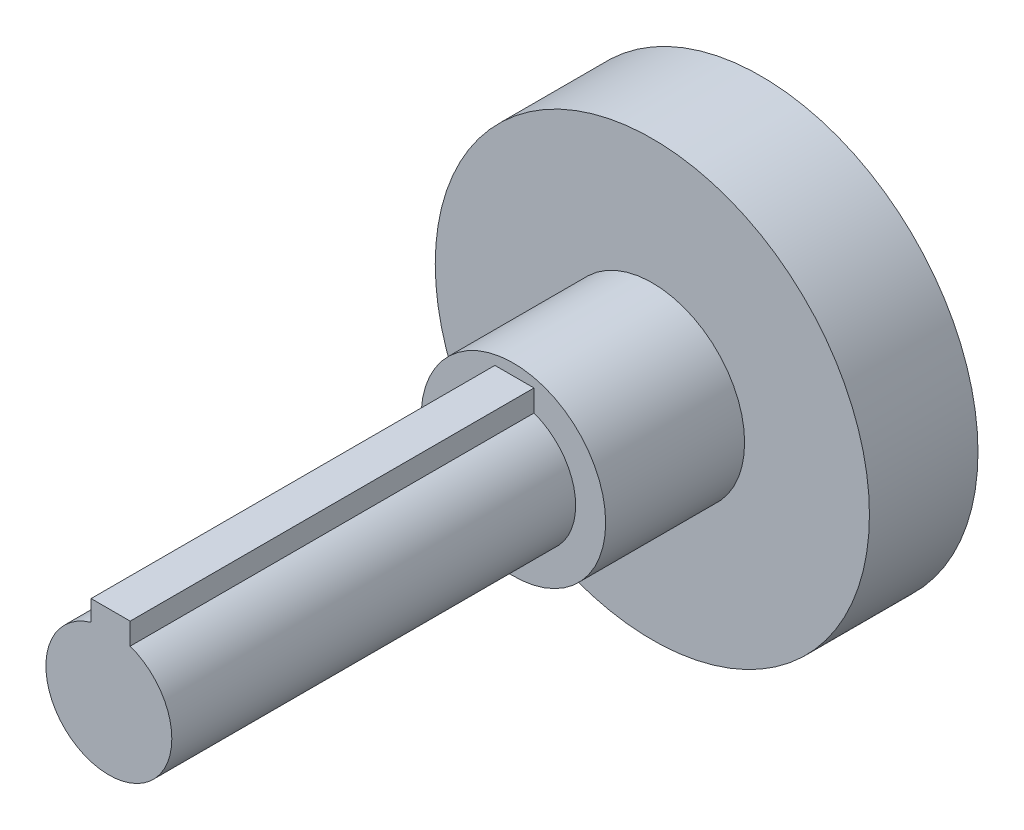
ISO-10303-21;
HEADER;
FILE_DESCRIPTION(('STEP AP214'),'2;1');
FILE_NAME('part.step','',(''),(''),'','','');
FILE_SCHEMA(('AUTOMOTIVE_DESIGN { 1 0 10303 214 1 1 1 1 }'));
ENDSEC;
DATA;
#1=APPLICATION_CONTEXT('core data for automotive mechanical design processes');
#2=APPLICATION_PROTOCOL_DEFINITION('international standard','automotive_design',2000,#1);
#3=PRODUCT_CONTEXT('',#1,'mechanical');
#4=PRODUCT('Part','Part','',(#3));
#5=PRODUCT_RELATED_PRODUCT_CATEGORY('part','',(#4));
#6=PRODUCT_DEFINITION_FORMATION('','',#4);
#7=PRODUCT_DEFINITION_CONTEXT('part definition',#1,'design');
#8=PRODUCT_DEFINITION('design','',#6,#7);
#9=PRODUCT_DEFINITION_SHAPE('','',#8);
#10=(LENGTH_UNIT() NAMED_UNIT(*) SI_UNIT(.MILLI.,.METRE.));
#11=(NAMED_UNIT(*) PLANE_ANGLE_UNIT() SI_UNIT($,.RADIAN.));
#12=(NAMED_UNIT(*) SI_UNIT($,.STERADIAN.) SOLID_ANGLE_UNIT());
#13=UNCERTAINTY_MEASURE_WITH_UNIT(LENGTH_MEASURE(1.E-05),#10,'distance_accuracy_value','');
#14=(GEOMETRIC_REPRESENTATION_CONTEXT(3) GLOBAL_UNCERTAINTY_ASSIGNED_CONTEXT((#13)) GLOBAL_UNIT_ASSIGNED_CONTEXT((#10,
#11,#12)) REPRESENTATION_CONTEXT('',''));
#15=CARTESIAN_POINT('',(0.,0.,0.));
#16=DIRECTION('',(0.,0.,1.));
#17=DIRECTION('',(1.,0.,0.));
#18=AXIS2_PLACEMENT_3D('',#15,#16,#17);
#19=CARTESIAN_POINT('',(0.,0.,5.));
#20=DIRECTION('',(0.,0.,-1.));
#21=DIRECTION('',(-1.,0.,0.));
#22=AXIS2_PLACEMENT_3D('',#19,#20,#21);
#23=CYLINDRICAL_SURFACE('',#22,10.);
#24=CARTESIAN_POINT('',(0.,0.,5.));
#25=DIRECTION('',(0.,0.,1.));
#26=DIRECTION('',(1.,0.,0.));
#27=AXIS2_PLACEMENT_3D('',#24,#25,#26);
#28=CIRCLE('',#27,10.);
#29=CARTESIAN_POINT('',(10.,0.,5.));
#30=VERTEX_POINT('',#29);
#31=EDGE_CURVE('E52',#30,#30,#28,.T.);
#32=ORIENTED_EDGE('',*,*,#31,.F.);
#33=EDGE_LOOP('',(#32));
#34=FACE_BOUND('',#33,.T.);
#35=CARTESIAN_POINT('',(0.,0.,0.));
#36=DIRECTION('',(0.,0.,1.));
#37=DIRECTION('',(1.,0.,0.));
#38=AXIS2_PLACEMENT_3D('',#35,#36,#37);
#39=CIRCLE('',#38,10.);
#40=CARTESIAN_POINT('',(10.,0.,0.));
#41=VERTEX_POINT('',#40);
#42=EDGE_CURVE('E47',#41,#41,#39,.T.);
#43=ORIENTED_EDGE('',*,*,#42,.T.);
#44=EDGE_LOOP('',(#43));
#45=FACE_BOUND('',#44,.T.);
#46=ADVANCED_FACE('F44',(#34,#45),#23,.T.);
#47=CARTESIAN_POINT('',(0.,0.,5.));
#48=DIRECTION('',(0.,0.,1.));
#49=DIRECTION('',(1.,0.,0.));
#50=AXIS2_PLACEMENT_3D('',#47,#48,#49);
#51=PLANE('',#50);
#52=CARTESIAN_POINT('',(0.,0.,5.));
#53=DIRECTION('',(0.,0.,1.));
#54=DIRECTION('',(1.,0.,0.));
#55=AXIS2_PLACEMENT_3D('',#52,#53,#54);
#56=CIRCLE('',#55,4.25);
#57=CARTESIAN_POINT('',(4.25,0.,5.));
#58=VERTEX_POINT('',#57);
#59=EDGE_CURVE('E11',#58,#58,#56,.T.);
#60=ORIENTED_EDGE('',*,*,#59,.F.);
#61=EDGE_LOOP('',(#60));
#62=FACE_BOUND('',#61,.T.);
#63=ORIENTED_EDGE('',*,*,#31,.T.);
#64=EDGE_LOOP('',(#63));
#65=FACE_BOUND('',#64,.T.);
#66=ADVANCED_FACE('F123',(#62,#65),#51,.T.);
#67=CARTESIAN_POINT('',(0.,0.,0.));
#68=DIRECTION('',(0.,0.,1.));
#69=DIRECTION('',(1.,0.,0.));
#70=AXIS2_PLACEMENT_3D('',#67,#68,#69);
#71=PLANE('',#70);
#72=ORIENTED_EDGE('',*,*,#42,.F.);
#73=EDGE_LOOP('',(#72));
#74=FACE_BOUND('',#73,.T.);
#75=ADVANCED_FACE('F120',(#74),#71,.F.);
#76=CARTESIAN_POINT('',(0.,0.,11.4));
#77=DIRECTION('',(0.,0.,-1.));
#78=DIRECTION('',(-1.,0.,0.));
#79=AXIS2_PLACEMENT_3D('',#76,#77,#78);
#80=CYLINDRICAL_SURFACE('',#79,4.25);
#81=CARTESIAN_POINT('',(0.,0.,11.4));
#82=DIRECTION('',(0.,0.,1.));
#83=DIRECTION('',(1.,0.,0.));
#84=AXIS2_PLACEMENT_3D('',#81,#82,#83);
#85=CIRCLE('',#84,4.25);
#86=CARTESIAN_POINT('',(4.25,0.,11.4));
#87=VERTEX_POINT('',#86);
#88=EDGE_CURVE('E106',#87,#87,#85,.T.);
#89=ORIENTED_EDGE('',*,*,#88,.F.);
#90=EDGE_LOOP('',(#89));
#91=FACE_BOUND('',#90,.T.);
#92=ORIENTED_EDGE('',*,*,#59,.T.);
#93=EDGE_LOOP('',(#92));
#94=FACE_BOUND('',#93,.T.);
#95=ADVANCED_FACE('F122',(#91,#94),#80,.T.);
#96=CARTESIAN_POINT('',(0.,0.,11.4));
#97=DIRECTION('',(0.,0.,1.));
#98=DIRECTION('',(1.,0.,0.));
#99=AXIS2_PLACEMENT_3D('',#96,#97,#98);
#100=PLANE('',#99);
#101=CARTESIAN_POINT('',(-0.0325449137602418,0.,11.4));
#102=DIRECTION('',(0.,0.,1.));
#103=DIRECTION('',(1.,0.,0.));
#104=AXIS2_PLACEMENT_3D('',#101,#102,#103);
#105=CIRCLE('',#104,2.9);
#106=CARTESIAN_POINT('',(-0.851088331871644,2.78208315344213,11.4));
#107=VERTEX_POINT('',#106);
#108=CARTESIAN_POINT('',(0.948911668128356,2.72887210727574,11.4));
#109=VERTEX_POINT('',#108);
#110=EDGE_CURVE('E60',#107,#109,#105,.T.);
#111=ORIENTED_EDGE('',*,*,#110,.F.);
#112=DIRECTION('',(0.,-1.,0.));
#113=VECTOR('',#112,1.);
#114=CARTESIAN_POINT('',(-0.851088331871644,3.72887210727574,11.4));
#115=LINE('',#114,#113);
#116=CARTESIAN_POINT('',(-0.851088331871644,3.72887210727574,11.4));
#117=VERTEX_POINT('',#116);
#118=EDGE_CURVE('E64',#117,#107,#115,.T.);
#119=ORIENTED_EDGE('',*,*,#118,.F.);
#120=DIRECTION('',(-1.,0.,0.));
#121=VECTOR('',#120,1.);
#122=CARTESIAN_POINT('',(-0.851088331871644,3.72887210727574,11.4));
#123=LINE('',#122,#121);
#124=CARTESIAN_POINT('',(0.948911668128356,3.72887210727574,11.4));
#125=VERTEX_POINT('',#124);
#126=EDGE_CURVE('E212',#125,#117,#123,.T.);
#127=ORIENTED_EDGE('',*,*,#126,.F.);
#128=DIRECTION('',(0.,1.,0.));
#129=VECTOR('',#128,1.);
#130=CARTESIAN_POINT('',(0.948911668128356,3.72887210727574,11.4));
#131=LINE('',#130,#129);
#132=EDGE_CURVE('E218',#109,#125,#131,.T.);
#133=ORIENTED_EDGE('',*,*,#132,.F.);
#134=EDGE_LOOP('',(#111,#119,#127,#133));
#135=FACE_BOUND('',#134,.T.);
#136=ORIENTED_EDGE('',*,*,#88,.T.);
#137=EDGE_LOOP('',(#136));
#138=FACE_BOUND('',#137,.T.);
#139=ADVANCED_FACE('F129',(#135,#138),#100,.T.);
#140=CARTESIAN_POINT('',(-0.0325449137602418,0.,30.));
#141=DIRECTION('',(0.,0.,-1.));
#142=DIRECTION('',(-1.,0.,0.));
#143=AXIS2_PLACEMENT_3D('',#140,#141,#142);
#144=CYLINDRICAL_SURFACE('',#143,2.9);
#145=ORIENTED_EDGE('',*,*,#110,.T.);
#146=DIRECTION('',(0.,0.,-1.));
#147=VECTOR('',#146,1.);
#148=CARTESIAN_POINT('',(0.948911668128356,2.72887210727574,30.));
#149=LINE('',#148,#147);
#150=CARTESIAN_POINT('',(0.948911668128356,2.72887210727574,30.));
#151=VERTEX_POINT('',#150);
#152=EDGE_CURVE('E89',#151,#109,#149,.T.);
#153=ORIENTED_EDGE('',*,*,#152,.F.);
#154=CARTESIAN_POINT('',(-0.0325449137602418,0.,30.));
#155=DIRECTION('',(0.,0.,1.));
#156=DIRECTION('',(1.,0.,0.));
#157=AXIS2_PLACEMENT_3D('',#154,#155,#156);
#158=CIRCLE('',#157,2.9);
#159=CARTESIAN_POINT('',(-0.851088331871644,2.78208315344213,30.));
#160=VERTEX_POINT('',#159);
#161=EDGE_CURVE('E95',#160,#151,#158,.T.);
#162=ORIENTED_EDGE('',*,*,#161,.F.);
#163=DIRECTION('',(0.,0.,-1.));
#164=VECTOR('',#163,1.);
#165=CARTESIAN_POINT('',(-0.851088331871644,2.78208315344213,30.));
#166=LINE('',#165,#164);
#167=EDGE_CURVE('E210',#160,#107,#166,.T.);
#168=ORIENTED_EDGE('',*,*,#167,.T.);
#169=EDGE_LOOP('',(#145,#153,#162,#168));
#170=FACE_BOUND('',#169,.T.);
#171=ADVANCED_FACE('F105',(#170),#144,.T.);
#172=CARTESIAN_POINT('',(0.948911668128356,3.72887210727574,30.));
#173=DIRECTION('',(-1.,0.,0.));
#174=DIRECTION('',(0.,-1.,0.));
#175=AXIS2_PLACEMENT_3D('',#172,#173,#174);
#176=PLANE('',#175);
#177=ORIENTED_EDGE('',*,*,#132,.T.);
#178=DIRECTION('',(0.,0.,-1.));
#179=VECTOR('',#178,1.);
#180=CARTESIAN_POINT('',(0.948911668128356,3.72887210727574,30.));
#181=LINE('',#180,#179);
#182=CARTESIAN_POINT('',(0.948911668128356,3.72887210727574,30.));
#183=VERTEX_POINT('',#182);
#184=EDGE_CURVE('E91',#183,#125,#181,.T.);
#185=ORIENTED_EDGE('',*,*,#184,.F.);
#186=DIRECTION('',(0.,1.,0.));
#187=VECTOR('',#186,1.);
#188=CARTESIAN_POINT('',(0.948911668128356,3.72887210727574,30.));
#189=LINE('',#188,#187);
#190=EDGE_CURVE('E84',#151,#183,#189,.T.);
#191=ORIENTED_EDGE('',*,*,#190,.F.);
#192=ORIENTED_EDGE('',*,*,#152,.T.);
#193=EDGE_LOOP('',(#177,#185,#191,#192));
#194=FACE_BOUND('',#193,.T.);
#195=ADVANCED_FACE('F87',(#194),#176,.F.);
#196=CARTESIAN_POINT('',(-0.851088331871644,3.72887210727574,30.));
#197=DIRECTION('',(0.,-1.,0.));
#198=DIRECTION('',(0.,0.,-1.));
#199=AXIS2_PLACEMENT_3D('',#196,#197,#198);
#200=PLANE('',#199);
#201=ORIENTED_EDGE('',*,*,#126,.T.);
#202=DIRECTION('',(0.,0.,-1.));
#203=VECTOR('',#202,1.);
#204=CARTESIAN_POINT('',(-0.851088331871644,3.72887210727574,30.));
#205=LINE('',#204,#203);
#206=CARTESIAN_POINT('',(-0.851088331871644,3.72887210727574,30.));
#207=VERTEX_POINT('',#206);
#208=EDGE_CURVE('E110',#207,#117,#205,.T.);
#209=ORIENTED_EDGE('',*,*,#208,.F.);
#210=DIRECTION('',(-1.,0.,0.));
#211=VECTOR('',#210,1.);
#212=CARTESIAN_POINT('',(-0.851088331871644,3.72887210727574,30.));
#213=LINE('',#212,#211);
#214=EDGE_CURVE('E94',#183,#207,#213,.T.);
#215=ORIENTED_EDGE('',*,*,#214,.F.);
#216=ORIENTED_EDGE('',*,*,#184,.T.);
#217=EDGE_LOOP('',(#201,#209,#215,#216));
#218=FACE_BOUND('',#217,.T.);
#219=ADVANCED_FACE('F179',(#218),#200,.F.);
#220=CARTESIAN_POINT('',(-0.851088331871644,3.72887210727574,30.));
#221=DIRECTION('',(1.,0.,0.));
#222=DIRECTION('',(0.,1.,0.));
#223=AXIS2_PLACEMENT_3D('',#220,#221,#222);
#224=PLANE('',#223);
#225=ORIENTED_EDGE('',*,*,#118,.T.);
#226=ORIENTED_EDGE('',*,*,#167,.F.);
#227=DIRECTION('',(0.,-1.,0.));
#228=VECTOR('',#227,1.);
#229=CARTESIAN_POINT('',(-0.851088331871644,3.72887210727574,30.));
#230=LINE('',#229,#228);
#231=EDGE_CURVE('E100',#207,#160,#230,.T.);
#232=ORIENTED_EDGE('',*,*,#231,.F.);
#233=ORIENTED_EDGE('',*,*,#208,.T.);
#234=EDGE_LOOP('',(#225,#226,#232,#233));
#235=FACE_BOUND('',#234,.T.);
#236=ADVANCED_FACE('F188',(#235),#224,.F.);
#237=CARTESIAN_POINT('',(-0.0325449137602418,0.,30.));
#238=DIRECTION('',(0.,0.,1.));
#239=DIRECTION('',(1.,0.,0.));
#240=AXIS2_PLACEMENT_3D('',#237,#238,#239);
#241=PLANE('',#240);
#242=ORIENTED_EDGE('',*,*,#161,.T.);
#243=ORIENTED_EDGE('',*,*,#190,.T.);
#244=ORIENTED_EDGE('',*,*,#214,.T.);
#245=ORIENTED_EDGE('',*,*,#231,.T.);
#246=EDGE_LOOP('',(#242,#243,#244,#245));
#247=FACE_BOUND('',#246,.T.);
#248=ADVANCED_FACE('F98',(#247),#241,.T.);
#249=CLOSED_SHELL('',(#46,#66,#75,#95,#139,#171,#195,#219,#236,#248));
#250=MANIFOLD_SOLID_BREP('B2',#249);
#251=ADVANCED_BREP_SHAPE_REPRESENTATION('',(#18,#250),#14);
#252=SHAPE_DEFINITION_REPRESENTATION(#9,#251);
ENDSEC;
END-ISO-10303-21;
